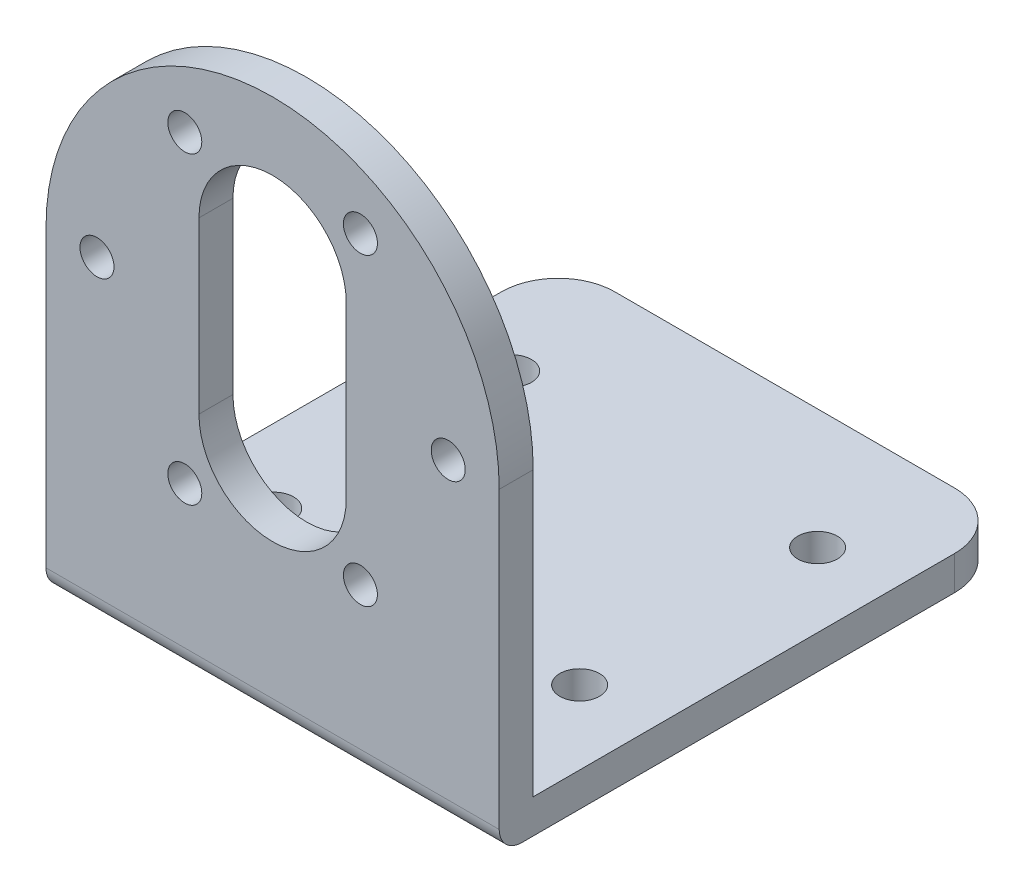
ISO-10303-21;
HEADER;
FILE_DESCRIPTION(('STEP AP214'),'2;1');
FILE_NAME('part.step','',(''),(''),'','','');
FILE_SCHEMA(('AUTOMOTIVE_DESIGN { 1 0 10303 214 1 1 1 1 }'));
ENDSEC;
DATA;
#1=APPLICATION_CONTEXT('core data for automotive mechanical design processes');
#2=APPLICATION_PROTOCOL_DEFINITION('international standard','automotive_design',2000,#1);
#3=PRODUCT_CONTEXT('',#1,'mechanical');
#4=PRODUCT('Part','Part','',(#3));
#5=PRODUCT_RELATED_PRODUCT_CATEGORY('part','',(#4));
#6=PRODUCT_DEFINITION_FORMATION('','',#4);
#7=PRODUCT_DEFINITION_CONTEXT('part definition',#1,'design');
#8=PRODUCT_DEFINITION('design','',#6,#7);
#9=PRODUCT_DEFINITION_SHAPE('','',#8);
#10=(LENGTH_UNIT() NAMED_UNIT(*) SI_UNIT(.MILLI.,.METRE.));
#11=(NAMED_UNIT(*) PLANE_ANGLE_UNIT() SI_UNIT($,.RADIAN.));
#12=(NAMED_UNIT(*) SI_UNIT($,.STERADIAN.) SOLID_ANGLE_UNIT());
#13=UNCERTAINTY_MEASURE_WITH_UNIT(LENGTH_MEASURE(1.E-05),#10,'distance_accuracy_value','');
#14=(GEOMETRIC_REPRESENTATION_CONTEXT(3) GLOBAL_UNCERTAINTY_ASSIGNED_CONTEXT((#13)) GLOBAL_UNIT_ASSIGNED_CONTEXT((#10,
#11,#12)) REPRESENTATION_CONTEXT('',''));
#15=CARTESIAN_POINT('',(0.,0.,0.));
#16=DIRECTION('',(0.,0.,1.));
#17=DIRECTION('',(1.,0.,0.));
#18=AXIS2_PLACEMENT_3D('',#15,#16,#17);
#19=CARTESIAN_POINT('',(0.,3.99999999999999,1.5));
#20=DIRECTION('',(0.,0.,-1.));
#21=DIRECTION('',(-1.,0.,0.));
#22=AXIS2_PLACEMENT_3D('',#19,#20,#21);
#23=PLANE('',#22);
#24=DIRECTION('',(0.,-1.,0.));
#25=VECTOR('',#24,1.);
#26=CARTESIAN_POINT('',(6.5,11.5,1.5));
#27=LINE('',#26,#25);
#28=CARTESIAN_POINT('',(6.5,11.5,1.5));
#29=VERTEX_POINT('',#28);
#30=CARTESIAN_POINT('',(6.5,-3.5,1.5));
#31=VERTEX_POINT('',#30);
#32=EDGE_CURVE('E182',#29,#31,#27,.T.);
#33=ORIENTED_EDGE('',*,*,#32,.T.);
#34=CARTESIAN_POINT('',(0.,-3.5,1.5));
#35=DIRECTION('',(0.,0.,1.));
#36=DIRECTION('',(1.,0.,0.));
#37=AXIS2_PLACEMENT_3D('',#34,#35,#36);
#38=CIRCLE('',#37,6.5);
#39=CARTESIAN_POINT('',(-6.5,-3.50000000000001,1.5));
#40=VERTEX_POINT('',#39);
#41=EDGE_CURVE('E167',#40,#31,#38,.T.);
#42=ORIENTED_EDGE('',*,*,#41,.F.);
#43=DIRECTION('',(0.,-1.,0.));
#44=VECTOR('',#43,1.);
#45=CARTESIAN_POINT('',(-6.5,11.5,1.5));
#46=LINE('',#45,#44);
#47=CARTESIAN_POINT('',(-6.5,11.5,1.5));
#48=VERTEX_POINT('',#47);
#49=EDGE_CURVE('E172',#48,#40,#46,.T.);
#50=ORIENTED_EDGE('',*,*,#49,.F.);
#51=CARTESIAN_POINT('',(0.,11.5,1.5));
#52=DIRECTION('',(0.,0.,1.));
#53=DIRECTION('',(1.,0.,0.));
#54=AXIS2_PLACEMENT_3D('',#51,#52,#53);
#55=CIRCLE('',#54,6.5);
#56=EDGE_CURVE('E185',#29,#48,#55,.T.);
#57=ORIENTED_EDGE('',*,*,#56,.F.);
#58=EDGE_LOOP('',(#33,#42,#50,#57));
#59=FACE_BOUND('',#58,.T.);
#60=DIRECTION('',(0.,-1.,0.));
#61=VECTOR('',#60,1.);
#62=CARTESIAN_POINT('',(-20.,-24.,1.5));
#63=LINE('',#62,#61);
#64=CARTESIAN_POINT('',(-20.,4.,1.5));
#65=VERTEX_POINT('',#64);
#66=CARTESIAN_POINT('',(-20.,-22.,1.5));
#67=VERTEX_POINT('',#66);
#68=EDGE_CURVE('E234',#65,#67,#63,.T.);
#69=ORIENTED_EDGE('',*,*,#68,.T.);
#70=DIRECTION('',(1.,0.,0.));
#71=VECTOR('',#70,1.);
#72=CARTESIAN_POINT('',(0.,-22.,1.5));
#73=LINE('',#72,#71);
#74=CARTESIAN_POINT('',(20.,-22.,1.5));
#75=VERTEX_POINT('',#74);
#76=EDGE_CURVE('E252',#67,#75,#73,.T.);
#77=ORIENTED_EDGE('',*,*,#76,.T.);
#78=DIRECTION('',(0.,1.,0.));
#79=VECTOR('',#78,1.);
#80=CARTESIAN_POINT('',(20.,-24.,1.5));
#81=LINE('',#80,#79);
#82=CARTESIAN_POINT('',(20.,4.,1.5));
#83=VERTEX_POINT('',#82);
#84=EDGE_CURVE('E237',#75,#83,#81,.T.);
#85=ORIENTED_EDGE('',*,*,#84,.T.);
#86=CARTESIAN_POINT('',(0.,3.99999999999999,1.5));
#87=DIRECTION('',(0.,0.,1.));
#88=DIRECTION('',(-1.,0.,0.));
#89=AXIS2_PLACEMENT_3D('',#86,#87,#88);
#90=CIRCLE('',#89,20.);
#91=EDGE_CURVE('E239',#83,#65,#90,.T.);
#92=ORIENTED_EDGE('',*,*,#91,.T.);
#93=EDGE_LOOP('',(#69,#77,#85,#92));
#94=FACE_BOUND('',#93,.T.);
#95=CARTESIAN_POINT('',(-15.5,4.,1.5));
#96=DIRECTION('',(0.,0.,1.));
#97=DIRECTION('',(1.,0.,0.));
#98=AXIS2_PLACEMENT_3D('',#95,#96,#97);
#99=CIRCLE('',#98,1.5);
#100=CARTESIAN_POINT('',(-14.,4.,1.5));
#101=VERTEX_POINT('',#100);
#102=EDGE_CURVE('E229',#101,#101,#99,.T.);
#103=ORIENTED_EDGE('',*,*,#102,.F.);
#104=EDGE_LOOP('',(#103));
#105=FACE_BOUND('',#104,.T.);
#106=CARTESIAN_POINT('',(-7.74999999999991,17.4233937586589,1.5));
#107=DIRECTION('',(0.,0.,1.));
#108=DIRECTION('',(1.,0.,0.));
#109=AXIS2_PLACEMENT_3D('',#106,#107,#108);
#110=CIRCLE('',#109,1.5);
#111=CARTESIAN_POINT('',(-6.24999999999991,17.4233937586589,1.5));
#112=VERTEX_POINT('',#111);
#113=EDGE_CURVE('E223',#112,#112,#110,.T.);
#114=ORIENTED_EDGE('',*,*,#113,.F.);
#115=EDGE_LOOP('',(#114));
#116=FACE_BOUND('',#115,.T.);
#117=CARTESIAN_POINT('',(7.75000000000023,17.4233937586589,1.5));
#118=DIRECTION('',(0.,0.,1.));
#119=DIRECTION('',(1.,0.,0.));
#120=AXIS2_PLACEMENT_3D('',#117,#118,#119);
#121=CIRCLE('',#120,1.5);
#122=CARTESIAN_POINT('',(9.25000000000023,17.4233937586589,1.5));
#123=VERTEX_POINT('',#122);
#124=EDGE_CURVE('E217',#123,#123,#121,.T.);
#125=ORIENTED_EDGE('',*,*,#124,.F.);
#126=EDGE_LOOP('',(#125));
#127=FACE_BOUND('',#126,.T.);
#128=CARTESIAN_POINT('',(15.5000000000002,3.99999999999989,1.5));
#129=DIRECTION('',(0.,0.,1.));
#130=DIRECTION('',(1.,0.,0.));
#131=AXIS2_PLACEMENT_3D('',#128,#129,#130);
#132=CIRCLE('',#131,1.5);
#133=CARTESIAN_POINT('',(17.0000000000002,3.99999999999989,1.5));
#134=VERTEX_POINT('',#133);
#135=EDGE_CURVE('E211',#134,#134,#132,.T.);
#136=ORIENTED_EDGE('',*,*,#135,.F.);
#137=EDGE_LOOP('',(#136));
#138=FACE_BOUND('',#137,.T.);
#139=CARTESIAN_POINT('',(7.75000000000004,-9.42339375865897,1.5));
#140=DIRECTION('',(0.,0.,1.));
#141=DIRECTION('',(1.,0.,0.));
#142=AXIS2_PLACEMENT_3D('',#139,#140,#141);
#143=CIRCLE('',#142,1.5);
#144=CARTESIAN_POINT('',(9.25000000000004,-9.42339375865897,1.5));
#145=VERTEX_POINT('',#144);
#146=EDGE_CURVE('E205',#145,#145,#143,.T.);
#147=ORIENTED_EDGE('',*,*,#146,.F.);
#148=EDGE_LOOP('',(#147));
#149=FACE_BOUND('',#148,.T.);
#150=CARTESIAN_POINT('',(-7.7500000000001,-9.4233937586588,1.5));
#151=DIRECTION('',(0.,0.,1.));
#152=DIRECTION('',(1.,0.,0.));
#153=AXIS2_PLACEMENT_3D('',#150,#151,#152);
#154=CIRCLE('',#153,1.5);
#155=CARTESIAN_POINT('',(-6.2500000000001,-9.4233937586588,1.5));
#156=VERTEX_POINT('',#155);
#157=EDGE_CURVE('E199',#156,#156,#154,.T.);
#158=ORIENTED_EDGE('',*,*,#157,.F.);
#159=EDGE_LOOP('',(#158));
#160=FACE_BOUND('',#159,.T.);
#161=ADVANCED_FACE('F34',(#59,#94,#105,#116,#127,#138,#149,#160),#23,.F.);
#162=CARTESIAN_POINT('',(0.,3.99999999999999,-1.5));
#163=DIRECTION('',(0.,0.,-1.));
#164=DIRECTION('',(-1.,0.,0.));
#165=AXIS2_PLACEMENT_3D('',#162,#163,#164);
#166=PLANE('',#165);
#167=DIRECTION('',(1.,0.,0.));
#168=VECTOR('',#167,1.);
#169=CARTESIAN_POINT('',(20.,-21.,-1.5));
#170=LINE('',#169,#168);
#171=CARTESIAN_POINT('',(-20.,-21.,-1.5));
#172=VERTEX_POINT('',#171);
#173=CARTESIAN_POINT('',(20.,-21.,-1.5));
#174=VERTEX_POINT('',#173);
#175=EDGE_CURVE('E149',#172,#174,#170,.T.);
#176=ORIENTED_EDGE('',*,*,#175,.F.);
#177=DIRECTION('',(0.,-1.,0.));
#178=VECTOR('',#177,1.);
#179=CARTESIAN_POINT('',(-20.,-24.,-1.5));
#180=LINE('',#179,#178);
#181=CARTESIAN_POINT('',(-20.,4.,-1.5));
#182=VERTEX_POINT('',#181);
#183=EDGE_CURVE('E152',#182,#172,#180,.T.);
#184=ORIENTED_EDGE('',*,*,#183,.F.);
#185=CARTESIAN_POINT('',(0.,3.99999999999999,-1.5));
#186=DIRECTION('',(0.,0.,1.));
#187=DIRECTION('',(-1.,0.,0.));
#188=AXIS2_PLACEMENT_3D('',#185,#186,#187);
#189=CIRCLE('',#188,20.);
#190=CARTESIAN_POINT('',(20.,4.,-1.5));
#191=VERTEX_POINT('',#190);
#192=EDGE_CURVE('E151',#191,#182,#189,.T.);
#193=ORIENTED_EDGE('',*,*,#192,.F.);
#194=DIRECTION('',(0.,1.,0.));
#195=VECTOR('',#194,1.);
#196=CARTESIAN_POINT('',(20.,-24.,-1.5));
#197=LINE('',#196,#195);
#198=EDGE_CURVE('E134',#174,#191,#197,.T.);
#199=ORIENTED_EDGE('',*,*,#198,.F.);
#200=EDGE_LOOP('',(#176,#184,#193,#199));
#201=FACE_BOUND('',#200,.T.);
#202=CARTESIAN_POINT('',(0.,-3.5,-1.5));
#203=DIRECTION('',(0.,0.,1.));
#204=DIRECTION('',(1.,0.,0.));
#205=AXIS2_PLACEMENT_3D('',#202,#203,#204);
#206=CIRCLE('',#205,6.5);
#207=CARTESIAN_POINT('',(-6.5,-3.50000000000001,-1.5));
#208=VERTEX_POINT('',#207);
#209=CARTESIAN_POINT('',(6.5,-3.5,-1.5));
#210=VERTEX_POINT('',#209);
#211=EDGE_CURVE('E168',#208,#210,#206,.T.);
#212=ORIENTED_EDGE('',*,*,#211,.T.);
#213=DIRECTION('',(0.,-1.,0.));
#214=VECTOR('',#213,1.);
#215=CARTESIAN_POINT('',(6.5,11.5,-1.5));
#216=LINE('',#215,#214);
#217=CARTESIAN_POINT('',(6.5,11.5,-1.5));
#218=VERTEX_POINT('',#217);
#219=EDGE_CURVE('E171',#218,#210,#216,.T.);
#220=ORIENTED_EDGE('',*,*,#219,.F.);
#221=CARTESIAN_POINT('',(0.,11.5,-1.5));
#222=DIRECTION('',(0.,0.,1.));
#223=DIRECTION('',(1.,0.,0.));
#224=AXIS2_PLACEMENT_3D('',#221,#222,#223);
#225=CIRCLE('',#224,6.5);
#226=CARTESIAN_POINT('',(-6.5,11.5,-1.5));
#227=VERTEX_POINT('',#226);
#228=EDGE_CURVE('E174',#218,#227,#225,.T.);
#229=ORIENTED_EDGE('',*,*,#228,.T.);
#230=DIRECTION('',(0.,-1.,0.));
#231=VECTOR('',#230,1.);
#232=CARTESIAN_POINT('',(-6.5,11.5,-1.5));
#233=LINE('',#232,#231);
#234=EDGE_CURVE('E177',#227,#208,#233,.T.);
#235=ORIENTED_EDGE('',*,*,#234,.T.);
#236=EDGE_LOOP('',(#212,#220,#229,#235));
#237=FACE_BOUND('',#236,.T.);
#238=CARTESIAN_POINT('',(7.75000000000004,-9.42339375865897,-1.5));
#239=DIRECTION('',(0.,0.,1.));
#240=DIRECTION('',(1.,0.,0.));
#241=AXIS2_PLACEMENT_3D('',#238,#239,#240);
#242=CIRCLE('',#241,1.5);
#243=CARTESIAN_POINT('',(9.25000000000004,-9.42339375865897,-1.5));
#244=VERTEX_POINT('',#243);
#245=EDGE_CURVE('E202',#244,#244,#242,.T.);
#246=ORIENTED_EDGE('',*,*,#245,.T.);
#247=EDGE_LOOP('',(#246));
#248=FACE_BOUND('',#247,.T.);
#249=CARTESIAN_POINT('',(7.75000000000023,17.4233937586589,-1.5));
#250=DIRECTION('',(0.,0.,1.));
#251=DIRECTION('',(1.,0.,0.));
#252=AXIS2_PLACEMENT_3D('',#249,#250,#251);
#253=CIRCLE('',#252,1.5);
#254=CARTESIAN_POINT('',(9.25000000000023,17.4233937586589,-1.5));
#255=VERTEX_POINT('',#254);
#256=EDGE_CURVE('E214',#255,#255,#253,.T.);
#257=ORIENTED_EDGE('',*,*,#256,.T.);
#258=EDGE_LOOP('',(#257));
#259=FACE_BOUND('',#258,.T.);
#260=CARTESIAN_POINT('',(-15.5,4.,-1.5));
#261=DIRECTION('',(0.,0.,1.));
#262=DIRECTION('',(1.,0.,0.));
#263=AXIS2_PLACEMENT_3D('',#260,#261,#262);
#264=CIRCLE('',#263,1.5);
#265=CARTESIAN_POINT('',(-14.,4.,-1.5));
#266=VERTEX_POINT('',#265);
#267=EDGE_CURVE('E226',#266,#266,#264,.T.);
#268=ORIENTED_EDGE('',*,*,#267,.T.);
#269=EDGE_LOOP('',(#268));
#270=FACE_BOUND('',#269,.T.);
#271=CARTESIAN_POINT('',(-7.74999999999991,17.4233937586589,-1.5));
#272=DIRECTION('',(0.,0.,1.));
#273=DIRECTION('',(1.,0.,0.));
#274=AXIS2_PLACEMENT_3D('',#271,#272,#273);
#275=CIRCLE('',#274,1.5);
#276=CARTESIAN_POINT('',(-6.24999999999991,17.4233937586589,-1.5));
#277=VERTEX_POINT('',#276);
#278=EDGE_CURVE('E220',#277,#277,#275,.T.);
#279=ORIENTED_EDGE('',*,*,#278,.T.);
#280=EDGE_LOOP('',(#279));
#281=FACE_BOUND('',#280,.T.);
#282=CARTESIAN_POINT('',(15.5000000000002,3.99999999999989,-1.5));
#283=DIRECTION('',(0.,0.,1.));
#284=DIRECTION('',(1.,0.,0.));
#285=AXIS2_PLACEMENT_3D('',#282,#283,#284);
#286=CIRCLE('',#285,1.5);
#287=CARTESIAN_POINT('',(17.0000000000002,3.99999999999989,-1.5));
#288=VERTEX_POINT('',#287);
#289=EDGE_CURVE('E208',#288,#288,#286,.T.);
#290=ORIENTED_EDGE('',*,*,#289,.T.);
#291=EDGE_LOOP('',(#290));
#292=FACE_BOUND('',#291,.T.);
#293=CARTESIAN_POINT('',(-7.7500000000001,-9.4233937586588,-1.5));
#294=DIRECTION('',(0.,0.,1.));
#295=DIRECTION('',(1.,0.,0.));
#296=AXIS2_PLACEMENT_3D('',#293,#294,#295);
#297=CIRCLE('',#296,1.5);
#298=CARTESIAN_POINT('',(-6.2500000000001,-9.4233937586588,-1.5));
#299=VERTEX_POINT('',#298);
#300=EDGE_CURVE('E192',#299,#299,#297,.T.);
#301=ORIENTED_EDGE('',*,*,#300,.T.);
#302=EDGE_LOOP('',(#301));
#303=FACE_BOUND('',#302,.T.);
#304=ADVANCED_FACE('F146',(#201,#237,#248,#259,#270,#281,#292,#303),#166,.T.);
#305=CARTESIAN_POINT('',(-20.,-24.,1.5));
#306=DIRECTION('',(1.,0.,0.));
#307=DIRECTION('',(0.,0.,-1.));
#308=AXIS2_PLACEMENT_3D('',#305,#306,#307);
#309=PLANE('',#308);
#310=DIRECTION('',(0.,0.,1.));
#311=VECTOR('',#310,1.);
#312=CARTESIAN_POINT('',(-20.,-21.,-43.7));
#313=LINE('',#312,#311);
#314=CARTESIAN_POINT('',(-20.,-21.,-38.7));
#315=VERTEX_POINT('',#314);
#316=EDGE_CURVE('E140',#315,#172,#313,.T.);
#317=ORIENTED_EDGE('',*,*,#316,.F.);
#318=DIRECTION('',(0.,1.,0.));
#319=VECTOR('',#318,1.);
#320=CARTESIAN_POINT('',(-20.,-24.,-38.7));
#321=LINE('',#320,#319);
#322=CARTESIAN_POINT('',(-20.,-24.,-38.7));
#323=VERTEX_POINT('',#322);
#324=EDGE_CURVE('E57',#315,#323,#321,.F.);
#325=ORIENTED_EDGE('',*,*,#324,.T.);
#326=DIRECTION('',(0.,0.,-1.));
#327=VECTOR('',#326,1.);
#328=CARTESIAN_POINT('',(-20.,-24.,1.5));
#329=LINE('',#328,#327);
#330=CARTESIAN_POINT('',(-20.,-24.,-0.5));
#331=VERTEX_POINT('',#330);
#332=EDGE_CURVE('E250',#331,#323,#329,.T.);
#333=ORIENTED_EDGE('',*,*,#332,.F.);
#334=CARTESIAN_POINT('',(-20.,-22.,-0.5));
#335=DIRECTION('',(1.,0.,0.));
#336=DIRECTION('',(0.,0.,-1.));
#337=AXIS2_PLACEMENT_3D('',#334,#335,#336);
#338=CIRCLE('',#337,2.);
#339=EDGE_CURVE('E259',#331,#67,#338,.F.);
#340=ORIENTED_EDGE('',*,*,#339,.T.);
#341=ORIENTED_EDGE('',*,*,#68,.F.);
#342=DIRECTION('',(0.,0.,-1.));
#343=VECTOR('',#342,1.);
#344=CARTESIAN_POINT('',(-20.,4.,1.5));
#345=LINE('',#344,#343);
#346=EDGE_CURVE('E241',#65,#182,#345,.T.);
#347=ORIENTED_EDGE('',*,*,#346,.T.);
#348=ORIENTED_EDGE('',*,*,#183,.T.);
#349=EDGE_LOOP('',(#317,#325,#333,#340,#341,#347,#348));
#350=FACE_BOUND('',#349,.T.);
#351=ADVANCED_FACE('F281',(#350),#309,.F.);
#352=CARTESIAN_POINT('',(-20.,-24.,1.5));
#353=DIRECTION('',(0.,1.,0.));
#354=DIRECTION('',(0.,0.,1.));
#355=AXIS2_PLACEMENT_3D('',#352,#353,#354);
#356=PLANE('',#355);
#357=CARTESIAN_POINT('',(-13.4999999999998,-24.,-12.1));
#358=DIRECTION('',(0.,1.,0.));
#359=DIRECTION('',(0.,0.,1.));
#360=AXIS2_PLACEMENT_3D('',#357,#358,#359);
#361=CIRCLE('',#360,1.75);
#362=CARTESIAN_POINT('',(-13.4999999999998,-24.,-10.35));
#363=VERTEX_POINT('',#362);
#364=EDGE_CURVE('E157',#363,#363,#361,.T.);
#365=ORIENTED_EDGE('',*,*,#364,.T.);
#366=EDGE_LOOP('',(#365));
#367=FACE_BOUND('',#366,.T.);
#368=CARTESIAN_POINT('',(13.5000000000002,-24.,-12.1));
#369=DIRECTION('',(0.,1.,0.));
#370=DIRECTION('',(0.,0.,1.));
#371=AXIS2_PLACEMENT_3D('',#368,#369,#370);
#372=CIRCLE('',#371,1.75);
#373=CARTESIAN_POINT('',(13.5000000000002,-24.,-10.35));
#374=VERTEX_POINT('',#373);
#375=EDGE_CURVE('E162',#374,#374,#372,.T.);
#376=ORIENTED_EDGE('',*,*,#375,.T.);
#377=EDGE_LOOP('',(#376));
#378=FACE_BOUND('',#377,.T.);
#379=CARTESIAN_POINT('',(13.5,-24.,-33.1));
#380=DIRECTION('',(0.,1.,0.));
#381=DIRECTION('',(0.,0.,1.));
#382=AXIS2_PLACEMENT_3D('',#379,#380,#381);
#383=CIRCLE('',#382,1.75);
#384=CARTESIAN_POINT('',(13.5,-24.,-31.35));
#385=VERTEX_POINT('',#384);
#386=EDGE_CURVE('E571',#385,#385,#383,.T.);
#387=ORIENTED_EDGE('',*,*,#386,.T.);
#388=EDGE_LOOP('',(#387));
#389=FACE_BOUND('',#388,.T.);
#390=CARTESIAN_POINT('',(-13.5,-24.,-33.1));
#391=DIRECTION('',(0.,1.,0.));
#392=DIRECTION('',(0.,0.,1.));
#393=AXIS2_PLACEMENT_3D('',#390,#391,#392);
#394=CIRCLE('',#393,1.75);
#395=CARTESIAN_POINT('',(-13.5,-24.,-31.35));
#396=VERTEX_POINT('',#395);
#397=EDGE_CURVE('E573',#396,#396,#394,.T.);
#398=ORIENTED_EDGE('',*,*,#397,.T.);
#399=EDGE_LOOP('',(#398));
#400=FACE_BOUND('',#399,.T.);
#401=ORIENTED_EDGE('',*,*,#332,.T.);
#402=CARTESIAN_POINT('',(-15.,-24.,-38.7));
#403=DIRECTION('',(0.,1.,0.));
#404=DIRECTION('',(0.,0.,1.));
#405=AXIS2_PLACEMENT_3D('',#402,#403,#404);
#406=CIRCLE('',#405,5.);
#407=CARTESIAN_POINT('',(-15.,-24.,-43.7));
#408=VERTEX_POINT('',#407);
#409=EDGE_CURVE('E42',#323,#408,#406,.F.);
#410=ORIENTED_EDGE('',*,*,#409,.T.);
#411=DIRECTION('',(-1.,0.,0.));
#412=VECTOR('',#411,1.);
#413=CARTESIAN_POINT('',(20.,-24.,-43.7));
#414=LINE('',#413,#412);
#415=CARTESIAN_POINT('',(15.,-24.,-43.7));
#416=VERTEX_POINT('',#415);
#417=EDGE_CURVE('E156',#416,#408,#414,.T.);
#418=ORIENTED_EDGE('',*,*,#417,.F.);
#419=CARTESIAN_POINT('',(15.,-24.,-38.7));
#420=DIRECTION('',(0.,1.,0.));
#421=DIRECTION('',(0.,0.,1.));
#422=AXIS2_PLACEMENT_3D('',#419,#420,#421);
#423=CIRCLE('',#422,5.);
#424=CARTESIAN_POINT('',(20.,-24.,-38.7));
#425=VERTEX_POINT('',#424);
#426=EDGE_CURVE('E49',#416,#425,#423,.F.);
#427=ORIENTED_EDGE('',*,*,#426,.T.);
#428=DIRECTION('',(0.,0.,-1.));
#429=VECTOR('',#428,1.);
#430=CARTESIAN_POINT('',(20.,-24.,1.5));
#431=LINE('',#430,#429);
#432=CARTESIAN_POINT('',(20.,-24.,-0.5));
#433=VERTEX_POINT('',#432);
#434=EDGE_CURVE('E248',#433,#425,#431,.T.);
#435=ORIENTED_EDGE('',*,*,#434,.F.);
#436=DIRECTION('',(1.,0.,0.));
#437=VECTOR('',#436,1.);
#438=CARTESIAN_POINT('',(-20.,-24.,-0.5));
#439=LINE('',#438,#437);
#440=EDGE_CURVE('E257',#433,#331,#439,.F.);
#441=ORIENTED_EDGE('',*,*,#440,.T.);
#442=EDGE_LOOP('',(#401,#410,#418,#427,#435,#441));
#443=FACE_BOUND('',#442,.T.);
#444=ADVANCED_FACE('F273',(#367,#378,#389,#400,#443),#356,.F.);
#445=CARTESIAN_POINT('',(20.,-24.,1.5));
#446=DIRECTION('',(-1.,0.,0.));
#447=DIRECTION('',(0.,0.,1.));
#448=AXIS2_PLACEMENT_3D('',#445,#446,#447);
#449=PLANE('',#448);
#450=ORIENTED_EDGE('',*,*,#434,.T.);
#451=DIRECTION('',(0.,-1.,0.));
#452=VECTOR('',#451,1.);
#453=CARTESIAN_POINT('',(20.,-24.,-38.7));
#454=LINE('',#453,#452);
#455=CARTESIAN_POINT('',(20.,-21.,-38.7));
#456=VERTEX_POINT('',#455);
#457=EDGE_CURVE('E11',#425,#456,#454,.F.);
#458=ORIENTED_EDGE('',*,*,#457,.T.);
#459=DIRECTION('',(0.,0.,1.));
#460=VECTOR('',#459,1.);
#461=CARTESIAN_POINT('',(20.,-21.,-43.7));
#462=LINE('',#461,#460);
#463=EDGE_CURVE('E130',#456,#174,#462,.T.);
#464=ORIENTED_EDGE('',*,*,#463,.T.);
#465=ORIENTED_EDGE('',*,*,#198,.T.);
#466=DIRECTION('',(0.,0.,-1.));
#467=VECTOR('',#466,1.);
#468=CARTESIAN_POINT('',(20.,4.,1.5));
#469=LINE('',#468,#467);
#470=EDGE_CURVE('E246',#83,#191,#469,.T.);
#471=ORIENTED_EDGE('',*,*,#470,.F.);
#472=ORIENTED_EDGE('',*,*,#84,.F.);
#473=CARTESIAN_POINT('',(20.,-22.,-0.5));
#474=DIRECTION('',(-1.,0.,0.));
#475=DIRECTION('',(0.,0.,1.));
#476=AXIS2_PLACEMENT_3D('',#473,#474,#475);
#477=CIRCLE('',#476,2.);
#478=EDGE_CURVE('E255',#75,#433,#477,.F.);
#479=ORIENTED_EDGE('',*,*,#478,.T.);
#480=EDGE_LOOP('',(#450,#458,#464,#465,#471,#472,#479));
#481=FACE_BOUND('',#480,.T.);
#482=ADVANCED_FACE('F132',(#481),#449,.F.);
#483=CARTESIAN_POINT('',(0.,3.99999999999999,1.5));
#484=DIRECTION('',(0.,0.,-1.));
#485=DIRECTION('',(-1.,0.,0.));
#486=AXIS2_PLACEMENT_3D('',#483,#484,#485);
#487=CYLINDRICAL_SURFACE('',#486,20.);
#488=ORIENTED_EDGE('',*,*,#192,.T.);
#489=ORIENTED_EDGE('',*,*,#346,.F.);
#490=ORIENTED_EDGE('',*,*,#91,.F.);
#491=ORIENTED_EDGE('',*,*,#470,.T.);
#492=EDGE_LOOP('',(#488,#489,#490,#491));
#493=FACE_BOUND('',#492,.T.);
#494=ADVANCED_FACE('F286',(#493),#487,.T.);
#495=CARTESIAN_POINT('',(-15.5,4.,1.5));
#496=DIRECTION('',(0.,0.,-1.));
#497=DIRECTION('',(-1.,0.,0.));
#498=AXIS2_PLACEMENT_3D('',#495,#496,#497);
#499=CYLINDRICAL_SURFACE('',#498,1.5);
#500=ORIENTED_EDGE('',*,*,#102,.T.);
#501=EDGE_LOOP('',(#500));
#502=FACE_BOUND('',#501,.T.);
#503=ORIENTED_EDGE('',*,*,#267,.F.);
#504=EDGE_LOOP('',(#503));
#505=FACE_BOUND('',#504,.T.);
#506=ADVANCED_FACE('F308',(#502,#505),#499,.F.);
#507=CARTESIAN_POINT('',(-7.74999999999991,17.4233937586589,1.5));
#508=DIRECTION('',(0.,0.,-1.));
#509=DIRECTION('',(-1.,0.,0.));
#510=AXIS2_PLACEMENT_3D('',#507,#508,#509);
#511=CYLINDRICAL_SURFACE('',#510,1.5);
#512=ORIENTED_EDGE('',*,*,#113,.T.);
#513=EDGE_LOOP('',(#512));
#514=FACE_BOUND('',#513,.T.);
#515=ORIENTED_EDGE('',*,*,#278,.F.);
#516=EDGE_LOOP('',(#515));
#517=FACE_BOUND('',#516,.T.);
#518=ADVANCED_FACE('F377',(#514,#517),#511,.F.);
#519=CARTESIAN_POINT('',(7.75000000000023,17.4233937586589,1.5));
#520=DIRECTION('',(0.,0.,-1.));
#521=DIRECTION('',(-1.,0.,0.));
#522=AXIS2_PLACEMENT_3D('',#519,#520,#521);
#523=CYLINDRICAL_SURFACE('',#522,1.5);
#524=ORIENTED_EDGE('',*,*,#124,.T.);
#525=EDGE_LOOP('',(#524));
#526=FACE_BOUND('',#525,.T.);
#527=ORIENTED_EDGE('',*,*,#256,.F.);
#528=EDGE_LOOP('',(#527));
#529=FACE_BOUND('',#528,.T.);
#530=ADVANCED_FACE('F374',(#526,#529),#523,.F.);
#531=CARTESIAN_POINT('',(15.5000000000002,3.99999999999989,1.5));
#532=DIRECTION('',(0.,0.,-1.));
#533=DIRECTION('',(-1.,0.,0.));
#534=AXIS2_PLACEMENT_3D('',#531,#532,#533);
#535=CYLINDRICAL_SURFACE('',#534,1.5);
#536=ORIENTED_EDGE('',*,*,#135,.T.);
#537=EDGE_LOOP('',(#536));
#538=FACE_BOUND('',#537,.T.);
#539=ORIENTED_EDGE('',*,*,#289,.F.);
#540=EDGE_LOOP('',(#539));
#541=FACE_BOUND('',#540,.T.);
#542=ADVANCED_FACE('F370',(#538,#541),#535,.F.);
#543=CARTESIAN_POINT('',(7.75000000000004,-9.42339375865897,1.5));
#544=DIRECTION('',(0.,0.,-1.));
#545=DIRECTION('',(-1.,0.,0.));
#546=AXIS2_PLACEMENT_3D('',#543,#544,#545);
#547=CYLINDRICAL_SURFACE('',#546,1.5);
#548=ORIENTED_EDGE('',*,*,#146,.T.);
#549=EDGE_LOOP('',(#548));
#550=FACE_BOUND('',#549,.T.);
#551=ORIENTED_EDGE('',*,*,#245,.F.);
#552=EDGE_LOOP('',(#551));
#553=FACE_BOUND('',#552,.T.);
#554=ADVANCED_FACE('F366',(#550,#553),#547,.F.);
#555=CARTESIAN_POINT('',(-7.7500000000001,-9.4233937586588,1.5));
#556=DIRECTION('',(0.,0.,-1.));
#557=DIRECTION('',(-1.,0.,0.));
#558=AXIS2_PLACEMENT_3D('',#555,#556,#557);
#559=CYLINDRICAL_SURFACE('',#558,1.5);
#560=ORIENTED_EDGE('',*,*,#157,.T.);
#561=EDGE_LOOP('',(#560));
#562=FACE_BOUND('',#561,.T.);
#563=ORIENTED_EDGE('',*,*,#300,.F.);
#564=EDGE_LOOP('',(#563));
#565=FACE_BOUND('',#564,.T.);
#566=ADVANCED_FACE('F362',(#562,#565),#559,.F.);
#567=CARTESIAN_POINT('',(0.,-3.5,-1.5));
#568=DIRECTION('',(0.,0.,1.));
#569=DIRECTION('',(1.,0.,0.));
#570=AXIS2_PLACEMENT_3D('',#567,#568,#569);
#571=CYLINDRICAL_SURFACE('',#570,6.5);
#572=ORIENTED_EDGE('',*,*,#41,.T.);
#573=DIRECTION('',(0.,0.,1.));
#574=VECTOR('',#573,1.);
#575=CARTESIAN_POINT('',(6.5,-3.5,-1.5));
#576=LINE('',#575,#574);
#577=EDGE_CURVE('E180',#210,#31,#576,.T.);
#578=ORIENTED_EDGE('',*,*,#577,.F.);
#579=ORIENTED_EDGE('',*,*,#211,.F.);
#580=DIRECTION('',(0.,0.,1.));
#581=VECTOR('',#580,1.);
#582=CARTESIAN_POINT('',(-6.5,-3.50000000000001,-1.5));
#583=LINE('',#582,#581);
#584=EDGE_CURVE('E190',#208,#40,#583,.T.);
#585=ORIENTED_EDGE('',*,*,#584,.T.);
#586=EDGE_LOOP('',(#572,#578,#579,#585));
#587=FACE_BOUND('',#586,.T.);
#588=ADVANCED_FACE('F352',(#587),#571,.F.);
#589=CARTESIAN_POINT('',(-6.5,11.5,-1.5));
#590=DIRECTION('',(-1.,0.,0.));
#591=DIRECTION('',(0.,0.,1.));
#592=AXIS2_PLACEMENT_3D('',#589,#590,#591);
#593=PLANE('',#592);
#594=ORIENTED_EDGE('',*,*,#49,.T.);
#595=ORIENTED_EDGE('',*,*,#584,.F.);
#596=ORIENTED_EDGE('',*,*,#234,.F.);
#597=DIRECTION('',(0.,0.,1.));
#598=VECTOR('',#597,1.);
#599=CARTESIAN_POINT('',(-6.5,11.5,-1.5));
#600=LINE('',#599,#598);
#601=EDGE_CURVE('E193',#227,#48,#600,.T.);
#602=ORIENTED_EDGE('',*,*,#601,.T.);
#603=EDGE_LOOP('',(#594,#595,#596,#602));
#604=FACE_BOUND('',#603,.T.);
#605=ADVANCED_FACE('F348',(#604),#593,.F.);
#606=CARTESIAN_POINT('',(0.,11.5,-1.5));
#607=DIRECTION('',(0.,0.,1.));
#608=DIRECTION('',(1.,0.,0.));
#609=AXIS2_PLACEMENT_3D('',#606,#607,#608);
#610=CYLINDRICAL_SURFACE('',#609,6.5);
#611=ORIENTED_EDGE('',*,*,#56,.T.);
#612=ORIENTED_EDGE('',*,*,#601,.F.);
#613=ORIENTED_EDGE('',*,*,#228,.F.);
#614=DIRECTION('',(0.,0.,1.));
#615=VECTOR('',#614,1.);
#616=CARTESIAN_POINT('',(6.5,11.5,-1.5));
#617=LINE('',#616,#615);
#618=EDGE_CURVE('E195',#218,#29,#617,.T.);
#619=ORIENTED_EDGE('',*,*,#618,.T.);
#620=EDGE_LOOP('',(#611,#612,#613,#619));
#621=FACE_BOUND('',#620,.T.);
#622=ADVANCED_FACE('F351',(#621),#610,.F.);
#623=CARTESIAN_POINT('',(6.5,11.5,-1.5));
#624=DIRECTION('',(-1.,0.,0.));
#625=DIRECTION('',(0.,0.,1.));
#626=AXIS2_PLACEMENT_3D('',#623,#624,#625);
#627=PLANE('',#626);
#628=ORIENTED_EDGE('',*,*,#32,.F.);
#629=ORIENTED_EDGE('',*,*,#618,.F.);
#630=ORIENTED_EDGE('',*,*,#219,.T.);
#631=ORIENTED_EDGE('',*,*,#577,.T.);
#632=EDGE_LOOP('',(#628,#629,#630,#631));
#633=FACE_BOUND('',#632,.T.);
#634=ADVANCED_FACE('F346',(#633),#627,.T.);
#635=CARTESIAN_POINT('',(20.,-21.,-43.7));
#636=DIRECTION('',(0.,-1.,0.));
#637=DIRECTION('',(0.,0.,-1.));
#638=AXIS2_PLACEMENT_3D('',#635,#636,#637);
#639=PLANE('',#638);
#640=CARTESIAN_POINT('',(-13.4999999999998,-21.,-12.1));
#641=DIRECTION('',(0.,1.,0.));
#642=DIRECTION('',(0.,0.,1.));
#643=AXIS2_PLACEMENT_3D('',#640,#641,#642);
#644=CIRCLE('',#643,1.75);
#645=CARTESIAN_POINT('',(-13.4999999999998,-21.,-10.35));
#646=VERTEX_POINT('',#645);
#647=EDGE_CURVE('E583',#646,#646,#644,.T.);
#648=ORIENTED_EDGE('',*,*,#647,.F.);
#649=EDGE_LOOP('',(#648));
#650=FACE_BOUND('',#649,.T.);
#651=CARTESIAN_POINT('',(13.5000000000002,-21.,-12.1));
#652=DIRECTION('',(0.,1.,0.));
#653=DIRECTION('',(0.,0.,1.));
#654=AXIS2_PLACEMENT_3D('',#651,#652,#653);
#655=CIRCLE('',#654,1.75);
#656=CARTESIAN_POINT('',(13.5000000000002,-21.,-10.35));
#657=VERTEX_POINT('',#656);
#658=EDGE_CURVE('E585',#657,#657,#655,.T.);
#659=ORIENTED_EDGE('',*,*,#658,.F.);
#660=EDGE_LOOP('',(#659));
#661=FACE_BOUND('',#660,.T.);
#662=CARTESIAN_POINT('',(13.5,-21.,-33.1));
#663=DIRECTION('',(0.,1.,0.));
#664=DIRECTION('',(0.,0.,1.));
#665=AXIS2_PLACEMENT_3D('',#662,#663,#664);
#666=CIRCLE('',#665,1.75);
#667=CARTESIAN_POINT('',(13.5,-21.,-31.35));
#668=VERTEX_POINT('',#667);
#669=EDGE_CURVE('E568',#668,#668,#666,.T.);
#670=ORIENTED_EDGE('',*,*,#669,.F.);
#671=EDGE_LOOP('',(#670));
#672=FACE_BOUND('',#671,.T.);
#673=CARTESIAN_POINT('',(-13.5,-21.,-33.1));
#674=DIRECTION('',(0.,1.,0.));
#675=DIRECTION('',(0.,0.,1.));
#676=AXIS2_PLACEMENT_3D('',#673,#674,#675);
#677=CIRCLE('',#676,1.75);
#678=CARTESIAN_POINT('',(-13.5,-21.,-31.35));
#679=VERTEX_POINT('',#678);
#680=EDGE_CURVE('E578',#679,#679,#677,.T.);
#681=ORIENTED_EDGE('',*,*,#680,.F.);
#682=EDGE_LOOP('',(#681));
#683=FACE_BOUND('',#682,.T.);
#684=DIRECTION('',(1.,0.,0.));
#685=VECTOR('',#684,1.);
#686=CARTESIAN_POINT('',(20.,-21.,-43.7));
#687=LINE('',#686,#685);
#688=CARTESIAN_POINT('',(-15.,-21.,-43.7));
#689=VERTEX_POINT('',#688);
#690=CARTESIAN_POINT('',(15.,-21.,-43.7));
#691=VERTEX_POINT('',#690);
#692=EDGE_CURVE('E141',#689,#691,#687,.T.);
#693=ORIENTED_EDGE('',*,*,#692,.F.);
#694=CARTESIAN_POINT('',(-15.,-21.,-38.7));
#695=DIRECTION('',(0.,-1.,0.));
#696=DIRECTION('',(0.,0.,-1.));
#697=AXIS2_PLACEMENT_3D('',#694,#695,#696);
#698=CIRCLE('',#697,5.);
#699=EDGE_CURVE('E269',#689,#315,#698,.F.);
#700=ORIENTED_EDGE('',*,*,#699,.T.);
#701=ORIENTED_EDGE('',*,*,#316,.T.);
#702=ORIENTED_EDGE('',*,*,#175,.T.);
#703=ORIENTED_EDGE('',*,*,#463,.F.);
#704=CARTESIAN_POINT('',(15.,-21.,-38.7));
#705=DIRECTION('',(0.,-1.,0.));
#706=DIRECTION('',(0.,0.,-1.));
#707=AXIS2_PLACEMENT_3D('',#704,#705,#706);
#708=CIRCLE('',#707,5.);
#709=EDGE_CURVE('E267',#456,#691,#708,.F.);
#710=ORIENTED_EDGE('',*,*,#709,.T.);
#711=EDGE_LOOP('',(#693,#700,#701,#702,#703,#710));
#712=FACE_BOUND('',#711,.T.);
#713=ADVANCED_FACE('F155',(#650,#661,#672,#683,#712),#639,.F.);
#714=CARTESIAN_POINT('',(0.,0.,-43.7));
#715=DIRECTION('',(0.,0.,1.));
#716=DIRECTION('',(1.,0.,0.));
#717=AXIS2_PLACEMENT_3D('',#714,#715,#716);
#718=PLANE('',#717);
#719=ORIENTED_EDGE('',*,*,#417,.T.);
#720=DIRECTION('',(0.,1.,0.));
#721=VECTOR('',#720,1.);
#722=CARTESIAN_POINT('',(-15.,0.,-43.7));
#723=LINE('',#722,#721);
#724=EDGE_CURVE('E264',#408,#689,#723,.T.);
#725=ORIENTED_EDGE('',*,*,#724,.T.);
#726=ORIENTED_EDGE('',*,*,#692,.T.);
#727=DIRECTION('',(0.,-1.,0.));
#728=VECTOR('',#727,1.);
#729=CARTESIAN_POINT('',(15.,0.,-43.7));
#730=LINE('',#729,#728);
#731=EDGE_CURVE('E261',#691,#416,#730,.T.);
#732=ORIENTED_EDGE('',*,*,#731,.T.);
#733=EDGE_LOOP('',(#719,#725,#726,#732));
#734=FACE_BOUND('',#733,.T.);
#735=ADVANCED_FACE('F277',(#734),#718,.F.);
#736=CARTESIAN_POINT('',(-13.5,-63.2,-33.1));
#737=DIRECTION('',(0.,1.,0.));
#738=DIRECTION('',(0.,0.,1.));
#739=AXIS2_PLACEMENT_3D('',#736,#737,#738);
#740=CYLINDRICAL_SURFACE('',#739,1.75);
#741=ORIENTED_EDGE('',*,*,#680,.T.);
#742=EDGE_LOOP('',(#741));
#743=FACE_BOUND('',#742,.T.);
#744=ORIENTED_EDGE('',*,*,#397,.F.);
#745=EDGE_LOOP('',(#744));
#746=FACE_BOUND('',#745,.T.);
#747=ADVANCED_FACE('F338',(#743,#746),#740,.F.);
#748=CARTESIAN_POINT('',(13.5,-63.2,-33.1));
#749=DIRECTION('',(0.,1.,0.));
#750=DIRECTION('',(0.,0.,1.));
#751=AXIS2_PLACEMENT_3D('',#748,#749,#750);
#752=CYLINDRICAL_SURFACE('',#751,1.75);
#753=ORIENTED_EDGE('',*,*,#669,.T.);
#754=EDGE_LOOP('',(#753));
#755=FACE_BOUND('',#754,.T.);
#756=ORIENTED_EDGE('',*,*,#386,.F.);
#757=EDGE_LOOP('',(#756));
#758=FACE_BOUND('',#757,.T.);
#759=ADVANCED_FACE('F331',(#755,#758),#752,.F.);
#760=CARTESIAN_POINT('',(13.5000000000002,-63.2,-12.1));
#761=DIRECTION('',(0.,1.,0.));
#762=DIRECTION('',(0.,0.,1.));
#763=AXIS2_PLACEMENT_3D('',#760,#761,#762);
#764=CYLINDRICAL_SURFACE('',#763,1.75);
#765=ORIENTED_EDGE('',*,*,#658,.T.);
#766=EDGE_LOOP('',(#765));
#767=FACE_BOUND('',#766,.T.);
#768=ORIENTED_EDGE('',*,*,#375,.F.);
#769=EDGE_LOOP('',(#768));
#770=FACE_BOUND('',#769,.T.);
#771=ADVANCED_FACE('F325',(#767,#770),#764,.F.);
#772=CARTESIAN_POINT('',(-13.4999999999998,-63.2,-12.1));
#773=DIRECTION('',(0.,1.,0.));
#774=DIRECTION('',(0.,0.,1.));
#775=AXIS2_PLACEMENT_3D('',#772,#773,#774);
#776=CYLINDRICAL_SURFACE('',#775,1.75);
#777=ORIENTED_EDGE('',*,*,#647,.T.);
#778=EDGE_LOOP('',(#777));
#779=FACE_BOUND('',#778,.T.);
#780=ORIENTED_EDGE('',*,*,#364,.F.);
#781=EDGE_LOOP('',(#780));
#782=FACE_BOUND('',#781,.T.);
#783=ADVANCED_FACE('F321',(#779,#782),#776,.F.);
#784=CARTESIAN_POINT('',(0.,-22.,-0.5));
#785=DIRECTION('',(1.,0.,0.));
#786=DIRECTION('',(0.,0.,-1.));
#787=AXIS2_PLACEMENT_3D('',#784,#785,#786);
#788=CYLINDRICAL_SURFACE('',#787,2.);
#789=ORIENTED_EDGE('',*,*,#339,.F.);
#790=ORIENTED_EDGE('',*,*,#440,.F.);
#791=ORIENTED_EDGE('',*,*,#478,.F.);
#792=ORIENTED_EDGE('',*,*,#76,.F.);
#793=EDGE_LOOP('',(#789,#790,#791,#792));
#794=FACE_BOUND('',#793,.T.);
#795=ADVANCED_FACE('F293',(#794),#788,.T.);
#796=CARTESIAN_POINT('',(-15.,0.,-38.7));
#797=DIRECTION('',(0.,1.,0.));
#798=DIRECTION('',(0.,0.,1.));
#799=AXIS2_PLACEMENT_3D('',#796,#797,#798);
#800=CYLINDRICAL_SURFACE('',#799,5.);
#801=ORIENTED_EDGE('',*,*,#409,.F.);
#802=ORIENTED_EDGE('',*,*,#324,.F.);
#803=ORIENTED_EDGE('',*,*,#699,.F.);
#804=ORIENTED_EDGE('',*,*,#724,.F.);
#805=EDGE_LOOP('',(#801,#802,#803,#804));
#806=FACE_BOUND('',#805,.T.);
#807=ADVANCED_FACE('F280',(#806),#800,.T.);
#808=CARTESIAN_POINT('',(15.,0.,-38.7));
#809=DIRECTION('',(0.,-1.,0.));
#810=DIRECTION('',(0.,0.,-1.));
#811=AXIS2_PLACEMENT_3D('',#808,#809,#810);
#812=CYLINDRICAL_SURFACE('',#811,5.);
#813=ORIENTED_EDGE('',*,*,#709,.F.);
#814=ORIENTED_EDGE('',*,*,#457,.F.);
#815=ORIENTED_EDGE('',*,*,#426,.F.);
#816=ORIENTED_EDGE('',*,*,#731,.F.);
#817=EDGE_LOOP('',(#813,#814,#815,#816));
#818=FACE_BOUND('',#817,.T.);
#819=ADVANCED_FACE('F36',(#818),#812,.T.);
#820=CLOSED_SHELL('',(#161,#304,#351,#444,#482,#494,#506,#518,#530,#542,#554,#566,#588,#605,
#622,#634,#713,#735,#747,#759,#771,#783,#795,#807,#819));
#821=MANIFOLD_SOLID_BREP('B2',#820);
#822=ADVANCED_BREP_SHAPE_REPRESENTATION('',(#18,#821),#14);
#823=SHAPE_DEFINITION_REPRESENTATION(#9,#822);
ENDSEC;
END-ISO-10303-21;
